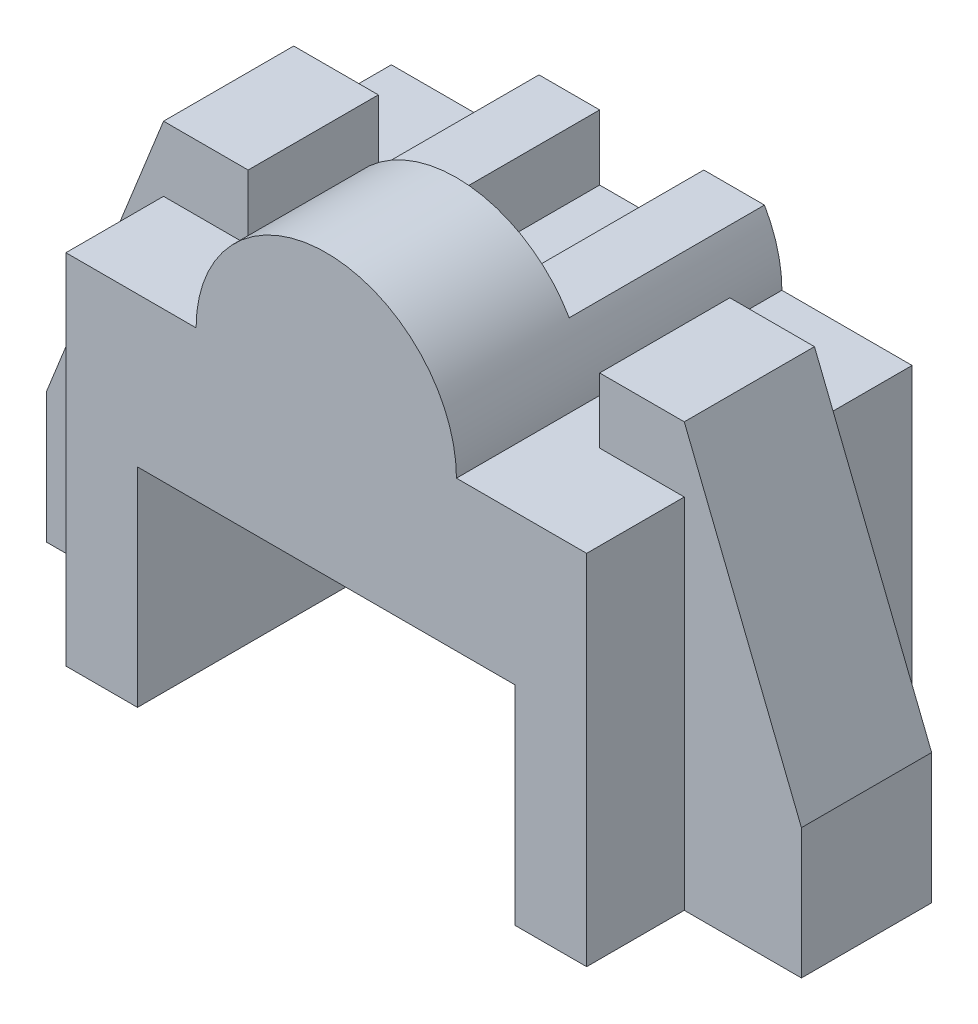
ISO-10303-21;
HEADER;
FILE_DESCRIPTION(('STEP AP214'),'2;1');
FILE_NAME('part.step','',(''),(''),'','','');
FILE_SCHEMA(('AUTOMOTIVE_DESIGN { 1 0 10303 214 1 1 1 1 }'));
ENDSEC;
DATA;
#1=APPLICATION_CONTEXT('core data for automotive mechanical design processes');
#2=APPLICATION_PROTOCOL_DEFINITION('international standard','automotive_design',2000,#1);
#3=PRODUCT_CONTEXT('',#1,'mechanical');
#4=PRODUCT('Part','Part','',(#3));
#5=PRODUCT_RELATED_PRODUCT_CATEGORY('part','',(#4));
#6=PRODUCT_DEFINITION_FORMATION('','',#4);
#7=PRODUCT_DEFINITION_CONTEXT('part definition',#1,'design');
#8=PRODUCT_DEFINITION('design','',#6,#7);
#9=PRODUCT_DEFINITION_SHAPE('','',#8);
#10=(LENGTH_UNIT() NAMED_UNIT(*) SI_UNIT(.MILLI.,.METRE.));
#11=(NAMED_UNIT(*) PLANE_ANGLE_UNIT() SI_UNIT($,.RADIAN.));
#12=(NAMED_UNIT(*) SI_UNIT($,.STERADIAN.) SOLID_ANGLE_UNIT());
#13=UNCERTAINTY_MEASURE_WITH_UNIT(LENGTH_MEASURE(1.E-05),#10,'distance_accuracy_value','');
#14=(GEOMETRIC_REPRESENTATION_CONTEXT(3) GLOBAL_UNCERTAINTY_ASSIGNED_CONTEXT((#13)) GLOBAL_UNIT_ASSIGNED_CONTEXT((#10,
#11,#12)) REPRESENTATION_CONTEXT('',''));
#15=CARTESIAN_POINT('',(0.,0.,0.));
#16=DIRECTION('',(0.,0.,1.));
#17=DIRECTION('',(1.,0.,0.));
#18=AXIS2_PLACEMENT_3D('',#15,#16,#17);
#19=CARTESIAN_POINT('',(40.,27.5,25.));
#20=DIRECTION('',(-1.,0.,0.));
#21=DIRECTION('',(0.,-1.,0.));
#22=AXIS2_PLACEMENT_3D('',#19,#20,#21);
#23=PLANE('',#22);
#24=DIRECTION('',(0.,-1.,0.));
#25=VECTOR('',#24,1.);
#26=CARTESIAN_POINT('',(40.,27.5,-10.));
#27=LINE('',#26,#25);
#28=CARTESIAN_POINT('',(40.,27.5,-10.));
#29=VERTEX_POINT('',#28);
#30=CARTESIAN_POINT('',(40.,-27.5,-10.));
#31=VERTEX_POINT('',#30);
#32=EDGE_CURVE('E48',#29,#31,#27,.T.);
#33=ORIENTED_EDGE('',*,*,#32,.T.);
#34=DIRECTION('',(0.,0.,-1.));
#35=VECTOR('',#34,1.);
#36=CARTESIAN_POINT('',(40.,-27.5,25.));
#37=LINE('',#36,#35);
#38=CARTESIAN_POINT('',(40.,-27.5,-25.));
#39=VERTEX_POINT('',#38);
#40=EDGE_CURVE('E442',#31,#39,#37,.T.);
#41=ORIENTED_EDGE('',*,*,#40,.T.);
#42=DIRECTION('',(0.,1.,0.));
#43=VECTOR('',#42,1.);
#44=CARTESIAN_POINT('',(40.,27.5,-25.));
#45=LINE('',#44,#43);
#46=CARTESIAN_POINT('',(40.,27.5,-25.));
#47=VERTEX_POINT('',#46);
#48=EDGE_CURVE('E383',#39,#47,#45,.T.);
#49=ORIENTED_EDGE('',*,*,#48,.T.);
#50=DIRECTION('',(0.,0.,-1.));
#51=VECTOR('',#50,1.);
#52=CARTESIAN_POINT('',(40.,27.5,25.));
#53=LINE('',#52,#51);
#54=EDGE_CURVE('E438',#29,#47,#53,.T.);
#55=ORIENTED_EDGE('',*,*,#54,.F.);
#56=EDGE_LOOP('',(#33,#41,#49,#55));
#57=FACE_BOUND('',#56,.T.);
#58=ADVANCED_FACE('F33',(#57),#23,.F.);
#59=CARTESIAN_POINT('',(-40.,-27.5,25.));
#60=DIRECTION('',(1.,0.,0.));
#61=DIRECTION('',(0.,0.,-1.));
#62=AXIS2_PLACEMENT_3D('',#59,#60,#61);
#63=PLANE('',#62);
#64=DIRECTION('',(0.,1.,0.));
#65=VECTOR('',#64,1.);
#66=CARTESIAN_POINT('',(-40.,27.5,-10.));
#67=LINE('',#66,#65);
#68=CARTESIAN_POINT('',(-40.,-27.5,-10.));
#69=VERTEX_POINT('',#68);
#70=CARTESIAN_POINT('',(-40.,27.5,-10.));
#71=VERTEX_POINT('',#70);
#72=EDGE_CURVE('E290',#69,#71,#67,.T.);
#73=ORIENTED_EDGE('',*,*,#72,.T.);
#74=DIRECTION('',(0.,0.,-1.));
#75=VECTOR('',#74,1.);
#76=CARTESIAN_POINT('',(-40.,27.5,25.));
#77=LINE('',#76,#75);
#78=CARTESIAN_POINT('',(-40.,27.5,-25.));
#79=VERTEX_POINT('',#78);
#80=EDGE_CURVE('E416',#71,#79,#77,.T.);
#81=ORIENTED_EDGE('',*,*,#80,.T.);
#82=DIRECTION('',(0.,-1.,0.));
#83=VECTOR('',#82,1.);
#84=CARTESIAN_POINT('',(-40.,-27.5,-25.));
#85=LINE('',#84,#83);
#86=CARTESIAN_POINT('',(-40.,-27.5,-25.));
#87=VERTEX_POINT('',#86);
#88=EDGE_CURVE('E354',#79,#87,#85,.T.);
#89=ORIENTED_EDGE('',*,*,#88,.T.);
#90=DIRECTION('',(0.,0.,-1.));
#91=VECTOR('',#90,1.);
#92=CARTESIAN_POINT('',(-40.,-27.5,25.));
#93=LINE('',#92,#91);
#94=EDGE_CURVE('E372',#69,#87,#93,.T.);
#95=ORIENTED_EDGE('',*,*,#94,.F.);
#96=EDGE_LOOP('',(#73,#81,#89,#95));
#97=FACE_BOUND('',#96,.T.);
#98=ADVANCED_FACE('F479',(#97),#63,.F.);
#99=CARTESIAN_POINT('',(8.,37.5,25.));
#100=DIRECTION('',(0.,-1.,0.));
#101=DIRECTION('',(0.,0.,-1.));
#102=AXIS2_PLACEMENT_3D('',#99,#100,#101);
#103=PLANE('',#102);
#104=DIRECTION('',(1.,0.,0.));
#105=VECTOR('',#104,1.);
#106=CARTESIAN_POINT('',(17.3205080756888,37.5,5.));
#107=LINE('',#106,#105);
#108=CARTESIAN_POINT('',(8.,37.5,5.));
#109=VERTEX_POINT('',#108);
#110=CARTESIAN_POINT('',(17.3205080756888,37.5,5.));
#111=VERTEX_POINT('',#110);
#112=EDGE_CURVE('E341',#109,#111,#107,.T.);
#113=ORIENTED_EDGE('',*,*,#112,.T.);
#114=DIRECTION('',(0.,0.,-1.));
#115=VECTOR('',#114,1.);
#116=CARTESIAN_POINT('',(17.3205080756888,37.5,25.));
#117=LINE('',#116,#115);
#118=CARTESIAN_POINT('',(17.3205080756888,37.5,-25.));
#119=VERTEX_POINT('',#118);
#120=EDGE_CURVE('E433',#111,#119,#117,.T.);
#121=ORIENTED_EDGE('',*,*,#120,.T.);
#122=DIRECTION('',(-1.,0.,0.));
#123=VECTOR('',#122,1.);
#124=CARTESIAN_POINT('',(8.,37.5,-25.));
#125=LINE('',#124,#123);
#126=CARTESIAN_POINT('',(8.,37.5,-25.));
#127=VERTEX_POINT('',#126);
#128=EDGE_CURVE('E391',#119,#127,#125,.T.);
#129=ORIENTED_EDGE('',*,*,#128,.T.);
#130=DIRECTION('',(0.,0.,-1.));
#131=VECTOR('',#130,1.);
#132=CARTESIAN_POINT('',(8.,37.5,25.));
#133=LINE('',#132,#131);
#134=EDGE_CURVE('E431',#109,#127,#133,.T.);
#135=ORIENTED_EDGE('',*,*,#134,.F.);
#136=EDGE_LOOP('',(#113,#121,#129,#135));
#137=FACE_BOUND('',#136,.T.);
#138=ADVANCED_FACE('F512',(#137),#103,.F.);
#139=CARTESIAN_POINT('',(8.,37.5,25.));
#140=DIRECTION('',(1.,0.,0.));
#141=DIRECTION('',(0.,0.,-1.));
#142=AXIS2_PLACEMENT_3D('',#139,#140,#141);
#143=PLANE('',#142);
#144=DIRECTION('',(0.,1.,0.));
#145=VECTOR('',#144,1.);
#146=CARTESIAN_POINT('',(8.,37.5,5.));
#147=LINE('',#146,#145);
#148=CARTESIAN_POINT('',(8.,27.5,5.));
#149=VERTEX_POINT('',#148);
#150=EDGE_CURVE('E338',#149,#109,#147,.T.);
#151=ORIENTED_EDGE('',*,*,#150,.T.);
#152=ORIENTED_EDGE('',*,*,#134,.T.);
#153=DIRECTION('',(0.,-1.,0.));
#154=VECTOR('',#153,1.);
#155=CARTESIAN_POINT('',(8.,37.5,-25.));
#156=LINE('',#155,#154);
#157=CARTESIAN_POINT('',(8.,27.5,-25.));
#158=VERTEX_POINT('',#157);
#159=EDGE_CURVE('E394',#127,#158,#156,.T.);
#160=ORIENTED_EDGE('',*,*,#159,.T.);
#161=DIRECTION('',(0.,0.,-1.));
#162=VECTOR('',#161,1.);
#163=CARTESIAN_POINT('',(8.,27.5,25.));
#164=LINE('',#163,#162);
#165=EDGE_CURVE('E429',#149,#158,#164,.T.);
#166=ORIENTED_EDGE('',*,*,#165,.F.);
#167=EDGE_LOOP('',(#151,#152,#160,#166));
#168=FACE_BOUND('',#167,.T.);
#169=ADVANCED_FACE('F509',(#168),#143,.F.);
#170=CARTESIAN_POINT('',(-8.,27.5,25.));
#171=DIRECTION('',(0.,-1.,0.));
#172=DIRECTION('',(0.,0.,-1.));
#173=AXIS2_PLACEMENT_3D('',#170,#171,#172);
#174=PLANE('',#173);
#175=DIRECTION('',(1.,0.,0.));
#176=VECTOR('',#175,1.);
#177=CARTESIAN_POINT('',(8.,27.5,5.));
#178=LINE('',#177,#176);
#179=CARTESIAN_POINT('',(-8.,27.5,5.));
#180=VERTEX_POINT('',#179);
#181=EDGE_CURVE('E335',#180,#149,#178,.T.);
#182=ORIENTED_EDGE('',*,*,#181,.T.);
#183=ORIENTED_EDGE('',*,*,#165,.T.);
#184=DIRECTION('',(-1.,0.,0.));
#185=VECTOR('',#184,1.);
#186=CARTESIAN_POINT('',(-8.,27.5,-25.));
#187=LINE('',#186,#185);
#188=CARTESIAN_POINT('',(-8.,27.5,-25.));
#189=VERTEX_POINT('',#188);
#190=EDGE_CURVE('E397',#158,#189,#187,.T.);
#191=ORIENTED_EDGE('',*,*,#190,.T.);
#192=DIRECTION('',(0.,0.,-1.));
#193=VECTOR('',#192,1.);
#194=CARTESIAN_POINT('',(-8.,27.5,25.));
#195=LINE('',#194,#193);
#196=EDGE_CURVE('E427',#180,#189,#195,.T.);
#197=ORIENTED_EDGE('',*,*,#196,.F.);
#198=EDGE_LOOP('',(#182,#183,#191,#197));
#199=FACE_BOUND('',#198,.T.);
#200=ADVANCED_FACE('F503',(#199),#174,.F.);
#201=CARTESIAN_POINT('',(-8.,27.5,25.));
#202=DIRECTION('',(-1.,0.,0.));
#203=DIRECTION('',(0.,0.,1.));
#204=AXIS2_PLACEMENT_3D('',#201,#202,#203);
#205=PLANE('',#204);
#206=DIRECTION('',(0.,-1.,0.));
#207=VECTOR('',#206,1.);
#208=CARTESIAN_POINT('',(-8.,27.5,5.));
#209=LINE('',#208,#207);
#210=CARTESIAN_POINT('',(-8.,37.5,5.));
#211=VERTEX_POINT('',#210);
#212=EDGE_CURVE('E332',#211,#180,#209,.T.);
#213=ORIENTED_EDGE('',*,*,#212,.T.);
#214=ORIENTED_EDGE('',*,*,#196,.T.);
#215=DIRECTION('',(0.,1.,0.));
#216=VECTOR('',#215,1.);
#217=CARTESIAN_POINT('',(-8.,27.5,-25.));
#218=LINE('',#217,#216);
#219=CARTESIAN_POINT('',(-8.,37.5,-25.));
#220=VERTEX_POINT('',#219);
#221=EDGE_CURVE('E400',#189,#220,#218,.T.);
#222=ORIENTED_EDGE('',*,*,#221,.T.);
#223=DIRECTION('',(0.,0.,-1.));
#224=VECTOR('',#223,1.);
#225=CARTESIAN_POINT('',(-8.,37.5,25.));
#226=LINE('',#225,#224);
#227=EDGE_CURVE('E425',#211,#220,#226,.T.);
#228=ORIENTED_EDGE('',*,*,#227,.F.);
#229=EDGE_LOOP('',(#213,#214,#222,#228));
#230=FACE_BOUND('',#229,.T.);
#231=ADVANCED_FACE('F500',(#230),#205,.F.);
#232=CARTESIAN_POINT('',(-8.,37.5,25.));
#233=DIRECTION('',(0.,-1.,0.));
#234=DIRECTION('',(0.,0.,-1.));
#235=AXIS2_PLACEMENT_3D('',#232,#233,#234);
#236=PLANE('',#235);
#237=DIRECTION('',(1.,0.,0.));
#238=VECTOR('',#237,1.);
#239=CARTESIAN_POINT('',(-8.,37.5,5.));
#240=LINE('',#239,#238);
#241=CARTESIAN_POINT('',(-17.3205080756888,37.5,5.));
#242=VERTEX_POINT('',#241);
#243=EDGE_CURVE('E346',#242,#211,#240,.T.);
#244=ORIENTED_EDGE('',*,*,#243,.T.);
#245=ORIENTED_EDGE('',*,*,#227,.T.);
#246=DIRECTION('',(-1.,0.,0.));
#247=VECTOR('',#246,1.);
#248=CARTESIAN_POINT('',(-8.,37.5,-25.));
#249=LINE('',#248,#247);
#250=CARTESIAN_POINT('',(-17.3205080756888,37.5,-25.));
#251=VERTEX_POINT('',#250);
#252=EDGE_CURVE('E403',#220,#251,#249,.T.);
#253=ORIENTED_EDGE('',*,*,#252,.T.);
#254=DIRECTION('',(0.,0.,-1.));
#255=VECTOR('',#254,1.);
#256=CARTESIAN_POINT('',(-17.3205080756888,37.5,25.));
#257=LINE('',#256,#255);
#258=EDGE_CURVE('E423',#242,#251,#257,.T.);
#259=ORIENTED_EDGE('',*,*,#258,.F.);
#260=EDGE_LOOP('',(#244,#245,#253,#259));
#261=FACE_BOUND('',#260,.T.);
#262=ADVANCED_FACE('F496',(#261),#236,.F.);
#263=CARTESIAN_POINT('',(-29.,-27.5,25.));
#264=DIRECTION('',(0.,1.,0.));
#265=DIRECTION('',(-1.,0.,0.));
#266=AXIS2_PLACEMENT_3D('',#263,#264,#265);
#267=PLANE('',#266);
#268=DIRECTION('',(1.,0.,0.));
#269=VECTOR('',#268,1.);
#270=CARTESIAN_POINT('',(-29.,-27.5,-25.));
#271=LINE('',#270,#269);
#272=CARTESIAN_POINT('',(-29.,-27.5,-25.));
#273=VERTEX_POINT('',#272);
#274=EDGE_CURVE('E349',#87,#273,#271,.T.);
#275=ORIENTED_EDGE('',*,*,#274,.T.);
#276=DIRECTION('',(0.,0.,-1.));
#277=VECTOR('',#276,1.);
#278=CARTESIAN_POINT('',(-29.,-27.5,25.));
#279=LINE('',#278,#277);
#280=CARTESIAN_POINT('',(-29.,-27.5,25.));
#281=VERTEX_POINT('',#280);
#282=EDGE_CURVE('E11',#281,#273,#279,.T.);
#283=ORIENTED_EDGE('',*,*,#282,.F.);
#284=DIRECTION('',(1.,0.,0.));
#285=VECTOR('',#284,1.);
#286=CARTESIAN_POINT('',(-29.,-27.5,25.));
#287=LINE('',#286,#285);
#288=CARTESIAN_POINT('',(-40.,-27.5,25.));
#289=VERTEX_POINT('',#288);
#290=EDGE_CURVE('E350',#289,#281,#287,.T.);
#291=ORIENTED_EDGE('',*,*,#290,.F.);
#292=CARTESIAN_POINT('',(-40.,-27.5,10.));
#293=VERTEX_POINT('',#292);
#294=EDGE_CURVE('E413',#289,#293,#93,.T.);
#295=ORIENTED_EDGE('',*,*,#294,.T.);
#296=DIRECTION('',(1.,0.,0.));
#297=VECTOR('',#296,1.);
#298=CARTESIAN_POINT('',(-40.,-27.5,10.));
#299=LINE('',#298,#297);
#300=CARTESIAN_POINT('',(-58.,-27.5,10.));
#301=VERTEX_POINT('',#300);
#302=EDGE_CURVE('E298',#301,#293,#299,.T.);
#303=ORIENTED_EDGE('',*,*,#302,.F.);
#304=DIRECTION('',(0.,0.,-1.));
#305=VECTOR('',#304,1.);
#306=CARTESIAN_POINT('',(-58.,-27.5,10.));
#307=LINE('',#306,#305);
#308=CARTESIAN_POINT('',(-58.,-27.5,-10.));
#309=VERTEX_POINT('',#308);
#310=EDGE_CURVE('E304',#301,#309,#307,.T.);
#311=ORIENTED_EDGE('',*,*,#310,.T.);
#312=DIRECTION('',(1.,0.,0.));
#313=VECTOR('',#312,1.);
#314=CARTESIAN_POINT('',(-40.,-27.5,-10.));
#315=LINE('',#314,#313);
#316=EDGE_CURVE('E314',#309,#69,#315,.T.);
#317=ORIENTED_EDGE('',*,*,#316,.T.);
#318=ORIENTED_EDGE('',*,*,#94,.T.);
#319=EDGE_LOOP('',(#275,#283,#291,#295,#303,#311,#317,#318));
#320=FACE_BOUND('',#319,.T.);
#321=ADVANCED_FACE('F35',(#320),#267,.F.);
#322=CARTESIAN_POINT('',(-29.,4.5,25.));
#323=DIRECTION('',(-1.,0.,0.));
#324=DIRECTION('',(0.,-1.,0.));
#325=AXIS2_PLACEMENT_3D('',#322,#323,#324);
#326=PLANE('',#325);
#327=DIRECTION('',(0.,1.,0.));
#328=VECTOR('',#327,1.);
#329=CARTESIAN_POINT('',(-29.,4.5,-25.));
#330=LINE('',#329,#328);
#331=CARTESIAN_POINT('',(-29.,4.5,-25.));
#332=VERTEX_POINT('',#331);
#333=EDGE_CURVE('E375',#273,#332,#330,.T.);
#334=ORIENTED_EDGE('',*,*,#333,.T.);
#335=DIRECTION('',(0.,0.,-1.));
#336=VECTOR('',#335,1.);
#337=CARTESIAN_POINT('',(-29.,4.5,25.));
#338=LINE('',#337,#336);
#339=CARTESIAN_POINT('',(-29.,4.5,25.));
#340=VERTEX_POINT('',#339);
#341=EDGE_CURVE('E41',#340,#332,#338,.T.);
#342=ORIENTED_EDGE('',*,*,#341,.F.);
#343=DIRECTION('',(0.,1.,0.));
#344=VECTOR('',#343,1.);
#345=CARTESIAN_POINT('',(-29.,4.5,25.));
#346=LINE('',#345,#344);
#347=EDGE_CURVE('E353',#281,#340,#346,.T.);
#348=ORIENTED_EDGE('',*,*,#347,.F.);
#349=ORIENTED_EDGE('',*,*,#282,.T.);
#350=EDGE_LOOP('',(#334,#342,#348,#349));
#351=FACE_BOUND('',#350,.T.);
#352=ADVANCED_FACE('F473',(#351),#326,.F.);
#353=CARTESIAN_POINT('',(29.,4.50000000000001,25.));
#354=DIRECTION('',(0.,1.,0.));
#355=DIRECTION('',(-1.,0.,0.));
#356=AXIS2_PLACEMENT_3D('',#353,#354,#355);
#357=PLANE('',#356);
#358=DIRECTION('',(1.,0.,0.));
#359=VECTOR('',#358,1.);
#360=CARTESIAN_POINT('',(29.,4.50000000000001,-25.));
#361=LINE('',#360,#359);
#362=CARTESIAN_POINT('',(29.,4.50000000000001,-25.));
#363=VERTEX_POINT('',#362);
#364=EDGE_CURVE('E377',#332,#363,#361,.T.);
#365=ORIENTED_EDGE('',*,*,#364,.T.);
#366=DIRECTION('',(0.,0.,-1.));
#367=VECTOR('',#366,1.);
#368=CARTESIAN_POINT('',(29.,4.50000000000001,25.));
#369=LINE('',#368,#367);
#370=CARTESIAN_POINT('',(29.,4.50000000000001,25.));
#371=VERTEX_POINT('',#370);
#372=EDGE_CURVE('E447',#371,#363,#369,.T.);
#373=ORIENTED_EDGE('',*,*,#372,.F.);
#374=DIRECTION('',(1.,0.,0.));
#375=VECTOR('',#374,1.);
#376=CARTESIAN_POINT('',(29.,4.50000000000001,25.));
#377=LINE('',#376,#375);
#378=EDGE_CURVE('E356',#340,#371,#377,.T.);
#379=ORIENTED_EDGE('',*,*,#378,.F.);
#380=ORIENTED_EDGE('',*,*,#341,.T.);
#381=EDGE_LOOP('',(#365,#373,#379,#380));
#382=FACE_BOUND('',#381,.T.);
#383=ADVANCED_FACE('F454',(#382),#357,.F.);
#384=CARTESIAN_POINT('',(29.,-27.5,25.));
#385=DIRECTION('',(1.,0.,0.));
#386=DIRECTION('',(0.,0.,-1.));
#387=AXIS2_PLACEMENT_3D('',#384,#385,#386);
#388=PLANE('',#387);
#389=DIRECTION('',(0.,-1.,0.));
#390=VECTOR('',#389,1.);
#391=CARTESIAN_POINT('',(29.,-27.5,-25.));
#392=LINE('',#391,#390);
#393=CARTESIAN_POINT('',(29.,-27.5,-25.));
#394=VERTEX_POINT('',#393);
#395=EDGE_CURVE('E379',#363,#394,#392,.T.);
#396=ORIENTED_EDGE('',*,*,#395,.T.);
#397=DIRECTION('',(0.,0.,-1.));
#398=VECTOR('',#397,1.);
#399=CARTESIAN_POINT('',(29.,-27.5,25.));
#400=LINE('',#399,#398);
#401=CARTESIAN_POINT('',(29.,-27.5,25.));
#402=VERTEX_POINT('',#401);
#403=EDGE_CURVE('E444',#402,#394,#400,.T.);
#404=ORIENTED_EDGE('',*,*,#403,.F.);
#405=DIRECTION('',(0.,-1.,0.));
#406=VECTOR('',#405,1.);
#407=CARTESIAN_POINT('',(29.,-27.5,25.));
#408=LINE('',#407,#406);
#409=EDGE_CURVE('E358',#371,#402,#408,.T.);
#410=ORIENTED_EDGE('',*,*,#409,.F.);
#411=ORIENTED_EDGE('',*,*,#372,.T.);
#412=EDGE_LOOP('',(#396,#404,#410,#411));
#413=FACE_BOUND('',#412,.T.);
#414=ADVANCED_FACE('F465',(#413),#388,.F.);
#415=CARTESIAN_POINT('',(40.,-27.5,25.));
#416=DIRECTION('',(0.,1.,0.));
#417=DIRECTION('',(0.,0.,1.));
#418=AXIS2_PLACEMENT_3D('',#415,#416,#417);
#419=PLANE('',#418);
#420=DIRECTION('',(1.,0.,0.));
#421=VECTOR('',#420,1.);
#422=CARTESIAN_POINT('',(40.,-27.5,-25.));
#423=LINE('',#422,#421);
#424=EDGE_CURVE('E381',#394,#39,#423,.T.);
#425=ORIENTED_EDGE('',*,*,#424,.T.);
#426=ORIENTED_EDGE('',*,*,#40,.F.);
#427=DIRECTION('',(1.,0.,0.));
#428=VECTOR('',#427,1.);
#429=CARTESIAN_POINT('',(40.,-27.5,-10.));
#430=LINE('',#429,#428);
#431=CARTESIAN_POINT('',(58.,-27.5,-10.));
#432=VERTEX_POINT('',#431);
#433=EDGE_CURVE('E247',#31,#432,#430,.T.);
#434=ORIENTED_EDGE('',*,*,#433,.T.);
#435=DIRECTION('',(0.,0.,-1.));
#436=VECTOR('',#435,1.);
#437=CARTESIAN_POINT('',(58.,-27.5,10.));
#438=LINE('',#437,#436);
#439=CARTESIAN_POINT('',(58.,-27.5,10.));
#440=VERTEX_POINT('',#439);
#441=EDGE_CURVE('E243',#440,#432,#438,.T.);
#442=ORIENTED_EDGE('',*,*,#441,.F.);
#443=DIRECTION('',(1.,0.,0.));
#444=VECTOR('',#443,1.);
#445=CARTESIAN_POINT('',(40.,-27.5,10.));
#446=LINE('',#445,#444);
#447=CARTESIAN_POINT('',(40.,-27.5,10.));
#448=VERTEX_POINT('',#447);
#449=EDGE_CURVE('E231',#448,#440,#446,.T.);
#450=ORIENTED_EDGE('',*,*,#449,.F.);
#451=CARTESIAN_POINT('',(40.,-27.5,25.));
#452=VERTEX_POINT('',#451);
#453=EDGE_CURVE('E56',#452,#448,#37,.T.);
#454=ORIENTED_EDGE('',*,*,#453,.F.);
#455=DIRECTION('',(1.,0.,0.));
#456=VECTOR('',#455,1.);
#457=CARTESIAN_POINT('',(40.,-27.5,25.));
#458=LINE('',#457,#456);
#459=EDGE_CURVE('E360',#402,#452,#458,.T.);
#460=ORIENTED_EDGE('',*,*,#459,.F.);
#461=ORIENTED_EDGE('',*,*,#403,.T.);
#462=EDGE_LOOP('',(#425,#426,#434,#442,#450,#454,#460,#461));
#463=FACE_BOUND('',#462,.T.);
#464=ADVANCED_FACE('F245',(#463),#419,.F.);
#465=ORIENTED_EDGE('',*,*,#453,.T.);
#466=DIRECTION('',(0.,-1.,0.));
#467=VECTOR('',#466,1.);
#468=CARTESIAN_POINT('',(40.,27.5,10.));
#469=LINE('',#468,#467);
#470=CARTESIAN_POINT('',(40.,27.5,10.));
#471=VERTEX_POINT('',#470);
#472=EDGE_CURVE('E239',#471,#448,#469,.T.);
#473=ORIENTED_EDGE('',*,*,#472,.F.);
#474=CARTESIAN_POINT('',(40.,27.5,25.));
#475=VERTEX_POINT('',#474);
#476=EDGE_CURVE('E439',#475,#471,#53,.T.);
#477=ORIENTED_EDGE('',*,*,#476,.F.);
#478=DIRECTION('',(0.,1.,0.));
#479=VECTOR('',#478,1.);
#480=CARTESIAN_POINT('',(40.,27.5,25.));
#481=LINE('',#480,#479);
#482=EDGE_CURVE('E362',#452,#475,#481,.T.);
#483=ORIENTED_EDGE('',*,*,#482,.F.);
#484=EDGE_LOOP('',(#465,#473,#477,#483));
#485=FACE_BOUND('',#484,.T.);
#486=ADVANCED_FACE('F539',(#485),#23,.F.);
#487=CARTESIAN_POINT('',(20.,27.5,25.));
#488=DIRECTION('',(0.,-1.,0.));
#489=DIRECTION('',(0.,0.,-1.));
#490=AXIS2_PLACEMENT_3D('',#487,#488,#489);
#491=PLANE('',#490);
#492=ORIENTED_EDGE('',*,*,#476,.T.);
#493=DIRECTION('',(1.,0.,0.));
#494=VECTOR('',#493,1.);
#495=CARTESIAN_POINT('',(27.,27.5,10.));
#496=LINE('',#495,#494);
#497=CARTESIAN_POINT('',(27.,27.5,10.));
#498=VERTEX_POINT('',#497);
#499=EDGE_CURVE('E536',#498,#471,#496,.T.);
#500=ORIENTED_EDGE('',*,*,#499,.F.);
#501=DIRECTION('',(0.,0.,-1.));
#502=VECTOR('',#501,1.);
#503=CARTESIAN_POINT('',(27.,27.5,10.));
#504=LINE('',#503,#502);
#505=CARTESIAN_POINT('',(27.,27.5,-10.));
#506=VERTEX_POINT('',#505);
#507=EDGE_CURVE('E250',#498,#506,#504,.T.);
#508=ORIENTED_EDGE('',*,*,#507,.T.);
#509=DIRECTION('',(1.,0.,0.));
#510=VECTOR('',#509,1.);
#511=CARTESIAN_POINT('',(27.,27.5,-10.));
#512=LINE('',#511,#510);
#513=EDGE_CURVE('E267',#506,#29,#512,.T.);
#514=ORIENTED_EDGE('',*,*,#513,.T.);
#515=ORIENTED_EDGE('',*,*,#54,.T.);
#516=DIRECTION('',(-1.,0.,0.));
#517=VECTOR('',#516,1.);
#518=CARTESIAN_POINT('',(20.,27.5,-25.));
#519=LINE('',#518,#517);
#520=CARTESIAN_POINT('',(20.,27.5,-25.));
#521=VERTEX_POINT('',#520);
#522=EDGE_CURVE('E386',#47,#521,#519,.T.);
#523=ORIENTED_EDGE('',*,*,#522,.T.);
#524=DIRECTION('',(0.,0.,-1.));
#525=VECTOR('',#524,1.);
#526=CARTESIAN_POINT('',(20.,27.5,25.));
#527=LINE('',#526,#525);
#528=CARTESIAN_POINT('',(20.,27.5,25.));
#529=VERTEX_POINT('',#528);
#530=EDGE_CURVE('E435',#529,#521,#527,.T.);
#531=ORIENTED_EDGE('',*,*,#530,.F.);
#532=DIRECTION('',(-1.,0.,0.));
#533=VECTOR('',#532,1.);
#534=CARTESIAN_POINT('',(20.,27.5,25.));
#535=LINE('',#534,#533);
#536=EDGE_CURVE('E364',#475,#529,#535,.T.);
#537=ORIENTED_EDGE('',*,*,#536,.F.);
#538=EDGE_LOOP('',(#492,#500,#508,#514,#515,#523,#531,#537));
#539=FACE_BOUND('',#538,.T.);
#540=ADVANCED_FACE('F517',(#539),#491,.F.);
#541=CARTESIAN_POINT('',(0.,27.5,25.));
#542=DIRECTION('',(0.,0.,-1.));
#543=DIRECTION('',(-1.,0.,0.));
#544=AXIS2_PLACEMENT_3D('',#541,#542,#543);
#545=CYLINDRICAL_SURFACE('',#544,20.);
#546=CARTESIAN_POINT('',(0.,27.5,-25.));
#547=DIRECTION('',(0.,0.,1.));
#548=DIRECTION('',(1.,0.,0.));
#549=AXIS2_PLACEMENT_3D('',#546,#547,#548);
#550=CIRCLE('',#549,20.);
#551=CARTESIAN_POINT('',(-20.,27.5,-25.));
#552=VERTEX_POINT('',#551);
#553=EDGE_CURVE('E406',#251,#552,#550,.T.);
#554=ORIENTED_EDGE('',*,*,#553,.T.);
#555=DIRECTION('',(0.,0.,-1.));
#556=VECTOR('',#555,1.);
#557=CARTESIAN_POINT('',(-20.,27.5,25.));
#558=LINE('',#557,#556);
#559=CARTESIAN_POINT('',(-20.,27.5,25.));
#560=VERTEX_POINT('',#559);
#561=EDGE_CURVE('E420',#560,#552,#558,.T.);
#562=ORIENTED_EDGE('',*,*,#561,.F.);
#563=CARTESIAN_POINT('',(0.,27.5,25.));
#564=DIRECTION('',(0.,0.,1.));
#565=DIRECTION('',(1.,0.,0.));
#566=AXIS2_PLACEMENT_3D('',#563,#564,#565);
#567=CIRCLE('',#566,20.);
#568=EDGE_CURVE('E366',#529,#560,#567,.T.);
#569=ORIENTED_EDGE('',*,*,#568,.F.);
#570=ORIENTED_EDGE('',*,*,#530,.T.);
#571=CARTESIAN_POINT('',(0.,27.5,-25.));
#572=DIRECTION('',(0.,0.,1.));
#573=DIRECTION('',(1.,0.,0.));
#574=AXIS2_PLACEMENT_3D('',#571,#572,#573);
#575=CIRCLE('',#574,20.);
#576=EDGE_CURVE('E388',#521,#119,#575,.T.);
#577=ORIENTED_EDGE('',*,*,#576,.T.);
#578=ORIENTED_EDGE('',*,*,#120,.F.);
#579=CARTESIAN_POINT('',(0.,27.5,5.));
#580=DIRECTION('',(0.,0.,1.));
#581=DIRECTION('',(1.,0.,0.));
#582=AXIS2_PLACEMENT_3D('',#579,#580,#581);
#583=CIRCLE('',#582,20.);
#584=EDGE_CURVE('E344',#111,#242,#583,.T.);
#585=ORIENTED_EDGE('',*,*,#584,.T.);
#586=ORIENTED_EDGE('',*,*,#258,.T.);
#587=EDGE_LOOP('',(#554,#562,#569,#570,#577,#578,#585,#586));
#588=FACE_BOUND('',#587,.T.);
#589=ADVANCED_FACE('F490',(#588),#545,.T.);
#590=CARTESIAN_POINT('',(-40.,27.5,25.));
#591=DIRECTION('',(0.,-1.,0.));
#592=DIRECTION('',(0.,0.,-1.));
#593=AXIS2_PLACEMENT_3D('',#590,#591,#592);
#594=PLANE('',#593);
#595=DIRECTION('',(0.,0.,-1.));
#596=VECTOR('',#595,1.);
#597=CARTESIAN_POINT('',(-27.,27.5,10.));
#598=LINE('',#597,#596);
#599=CARTESIAN_POINT('',(-27.,27.5,10.));
#600=VERTEX_POINT('',#599);
#601=CARTESIAN_POINT('',(-27.,27.5,-10.));
#602=VERTEX_POINT('',#601);
#603=EDGE_CURVE('E329',#600,#602,#598,.T.);
#604=ORIENTED_EDGE('',*,*,#603,.F.);
#605=DIRECTION('',(1.,0.,0.));
#606=VECTOR('',#605,1.);
#607=CARTESIAN_POINT('',(-27.,27.5,10.));
#608=LINE('',#607,#606);
#609=CARTESIAN_POINT('',(-40.,27.5,10.));
#610=VERTEX_POINT('',#609);
#611=EDGE_CURVE('E286',#610,#600,#608,.T.);
#612=ORIENTED_EDGE('',*,*,#611,.F.);
#613=CARTESIAN_POINT('',(-40.,27.5,25.));
#614=VERTEX_POINT('',#613);
#615=EDGE_CURVE('E417',#614,#610,#77,.T.);
#616=ORIENTED_EDGE('',*,*,#615,.F.);
#617=DIRECTION('',(-1.,0.,0.));
#618=VECTOR('',#617,1.);
#619=CARTESIAN_POINT('',(-40.,27.5,25.));
#620=LINE('',#619,#618);
#621=EDGE_CURVE('E368',#560,#614,#620,.T.);
#622=ORIENTED_EDGE('',*,*,#621,.F.);
#623=ORIENTED_EDGE('',*,*,#561,.T.);
#624=DIRECTION('',(-1.,0.,0.));
#625=VECTOR('',#624,1.);
#626=CARTESIAN_POINT('',(-40.,27.5,-25.));
#627=LINE('',#626,#625);
#628=EDGE_CURVE('E408',#552,#79,#627,.T.);
#629=ORIENTED_EDGE('',*,*,#628,.T.);
#630=ORIENTED_EDGE('',*,*,#80,.F.);
#631=DIRECTION('',(1.,0.,0.));
#632=VECTOR('',#631,1.);
#633=CARTESIAN_POINT('',(-27.,27.5,-10.));
#634=LINE('',#633,#632);
#635=EDGE_CURVE('E285',#71,#602,#634,.T.);
#636=ORIENTED_EDGE('',*,*,#635,.T.);
#637=EDGE_LOOP('',(#604,#612,#616,#622,#623,#629,#630,#636));
#638=FACE_BOUND('',#637,.T.);
#639=ADVANCED_FACE('F484',(#638),#594,.F.);
#640=ORIENTED_EDGE('',*,*,#615,.T.);
#641=DIRECTION('',(0.,1.,0.));
#642=VECTOR('',#641,1.);
#643=CARTESIAN_POINT('',(-40.,27.5,10.));
#644=LINE('',#643,#642);
#645=EDGE_CURVE('E301',#293,#610,#644,.T.);
#646=ORIENTED_EDGE('',*,*,#645,.F.);
#647=ORIENTED_EDGE('',*,*,#294,.F.);
#648=DIRECTION('',(0.,-1.,0.));
#649=VECTOR('',#648,1.);
#650=CARTESIAN_POINT('',(-40.,-27.5,25.));
#651=LINE('',#650,#649);
#652=EDGE_CURVE('E370',#614,#289,#651,.T.);
#653=ORIENTED_EDGE('',*,*,#652,.F.);
#654=EDGE_LOOP('',(#640,#646,#647,#653));
#655=FACE_BOUND('',#654,.T.);
#656=ADVANCED_FACE('F553',(#655),#63,.F.);
#657=CARTESIAN_POINT('',(0.,27.5,25.));
#658=DIRECTION('',(0.,0.,1.));
#659=DIRECTION('',(1.,0.,0.));
#660=AXIS2_PLACEMENT_3D('',#657,#658,#659);
#661=PLANE('',#660);
#662=ORIENTED_EDGE('',*,*,#568,.T.);
#663=ORIENTED_EDGE('',*,*,#621,.T.);
#664=ORIENTED_EDGE('',*,*,#652,.T.);
#665=ORIENTED_EDGE('',*,*,#290,.T.);
#666=ORIENTED_EDGE('',*,*,#347,.T.);
#667=ORIENTED_EDGE('',*,*,#378,.T.);
#668=ORIENTED_EDGE('',*,*,#409,.T.);
#669=ORIENTED_EDGE('',*,*,#459,.T.);
#670=ORIENTED_EDGE('',*,*,#482,.T.);
#671=ORIENTED_EDGE('',*,*,#536,.T.);
#672=EDGE_LOOP('',(#662,#663,#664,#665,#666,#667,#668,#669,#670,#671));
#673=FACE_BOUND('',#672,.T.);
#674=ADVANCED_FACE('F469',(#673),#661,.T.);
#675=CARTESIAN_POINT('',(0.,27.5,-25.));
#676=DIRECTION('',(0.,0.,1.));
#677=DIRECTION('',(1.,0.,0.));
#678=AXIS2_PLACEMENT_3D('',#675,#676,#677);
#679=PLANE('',#678);
#680=ORIENTED_EDGE('',*,*,#274,.F.);
#681=ORIENTED_EDGE('',*,*,#88,.F.);
#682=ORIENTED_EDGE('',*,*,#628,.F.);
#683=ORIENTED_EDGE('',*,*,#553,.F.);
#684=ORIENTED_EDGE('',*,*,#252,.F.);
#685=ORIENTED_EDGE('',*,*,#221,.F.);
#686=ORIENTED_EDGE('',*,*,#190,.F.);
#687=ORIENTED_EDGE('',*,*,#159,.F.);
#688=ORIENTED_EDGE('',*,*,#128,.F.);
#689=ORIENTED_EDGE('',*,*,#576,.F.);
#690=ORIENTED_EDGE('',*,*,#522,.F.);
#691=ORIENTED_EDGE('',*,*,#48,.F.);
#692=ORIENTED_EDGE('',*,*,#424,.F.);
#693=ORIENTED_EDGE('',*,*,#395,.F.);
#694=ORIENTED_EDGE('',*,*,#364,.F.);
#695=ORIENTED_EDGE('',*,*,#333,.F.);
#696=EDGE_LOOP('',(#680,#681,#682,#683,#684,#685,#686,#687,#688,#689,#690,#691,#692,#693,#694,#695));
#697=FACE_BOUND('',#696,.T.);
#698=ADVANCED_FACE('F460',(#697),#679,.F.);
#699=CARTESIAN_POINT('',(0.,27.5,5.));
#700=DIRECTION('',(0.,0.,1.));
#701=DIRECTION('',(1.,0.,0.));
#702=AXIS2_PLACEMENT_3D('',#699,#700,#701);
#703=PLANE('',#702);
#704=ORIENTED_EDGE('',*,*,#212,.F.);
#705=ORIENTED_EDGE('',*,*,#243,.F.);
#706=ORIENTED_EDGE('',*,*,#584,.F.);
#707=ORIENTED_EDGE('',*,*,#112,.F.);
#708=ORIENTED_EDGE('',*,*,#150,.F.);
#709=ORIENTED_EDGE('',*,*,#181,.F.);
#710=EDGE_LOOP('',(#704,#705,#706,#707,#708,#709));
#711=FACE_BOUND('',#710,.T.);
#712=ADVANCED_FACE('F609',(#711),#703,.F.);
#713=CARTESIAN_POINT('',(-27.,37.5,10.));
#714=DIRECTION('',(-1.,0.,0.));
#715=DIRECTION('',(0.,-1.,0.));
#716=AXIS2_PLACEMENT_3D('',#713,#714,#715);
#717=PLANE('',#716);
#718=DIRECTION('',(0.,1.,0.));
#719=VECTOR('',#718,1.);
#720=CARTESIAN_POINT('',(-27.,37.5,-10.));
#721=LINE('',#720,#719);
#722=CARTESIAN_POINT('',(-27.,37.5,-10.));
#723=VERTEX_POINT('',#722);
#724=EDGE_CURVE('E306',#602,#723,#721,.T.);
#725=ORIENTED_EDGE('',*,*,#724,.T.);
#726=DIRECTION('',(0.,0.,-1.));
#727=VECTOR('',#726,1.);
#728=CARTESIAN_POINT('',(-27.,37.5,10.));
#729=LINE('',#728,#727);
#730=CARTESIAN_POINT('',(-27.,37.5,10.));
#731=VERTEX_POINT('',#730);
#732=EDGE_CURVE('E326',#731,#723,#729,.T.);
#733=ORIENTED_EDGE('',*,*,#732,.F.);
#734=DIRECTION('',(0.,1.,0.));
#735=VECTOR('',#734,1.);
#736=CARTESIAN_POINT('',(-27.,37.5,10.));
#737=LINE('',#736,#735);
#738=EDGE_CURVE('E289',#600,#731,#737,.T.);
#739=ORIENTED_EDGE('',*,*,#738,.F.);
#740=ORIENTED_EDGE('',*,*,#603,.T.);
#741=EDGE_LOOP('',(#725,#733,#739,#740));
#742=FACE_BOUND('',#741,.T.);
#743=ADVANCED_FACE('F585',(#742),#717,.F.);
#744=CARTESIAN_POINT('',(-40.,37.5,10.));
#745=DIRECTION('',(0.,-1.,0.));
#746=DIRECTION('',(1.,0.,0.));
#747=AXIS2_PLACEMENT_3D('',#744,#745,#746);
#748=PLANE('',#747);
#749=DIRECTION('',(-1.,0.,0.));
#750=VECTOR('',#749,1.);
#751=CARTESIAN_POINT('',(-40.,37.5,-10.));
#752=LINE('',#751,#750);
#753=CARTESIAN_POINT('',(-40.,37.5,-10.));
#754=VERTEX_POINT('',#753);
#755=EDGE_CURVE('E308',#723,#754,#752,.T.);
#756=ORIENTED_EDGE('',*,*,#755,.T.);
#757=DIRECTION('',(0.,0.,-1.));
#758=VECTOR('',#757,1.);
#759=CARTESIAN_POINT('',(-40.,37.5,10.));
#760=LINE('',#759,#758);
#761=CARTESIAN_POINT('',(-40.,37.5,10.));
#762=VERTEX_POINT('',#761);
#763=EDGE_CURVE('E323',#762,#754,#760,.T.);
#764=ORIENTED_EDGE('',*,*,#763,.F.);
#765=DIRECTION('',(-1.,0.,0.));
#766=VECTOR('',#765,1.);
#767=CARTESIAN_POINT('',(-40.,37.5,10.));
#768=LINE('',#767,#766);
#769=EDGE_CURVE('E292',#731,#762,#768,.T.);
#770=ORIENTED_EDGE('',*,*,#769,.F.);
#771=ORIENTED_EDGE('',*,*,#732,.T.);
#772=EDGE_LOOP('',(#756,#764,#770,#771));
#773=FACE_BOUND('',#772,.T.);
#774=ADVANCED_FACE('F591',(#773),#748,.F.);
#775=CARTESIAN_POINT('',(-58.,-7.50000000000001,10.));
#776=DIRECTION('',(0.928476690885259,-0.371390676354104,0.));
#777=DIRECTION('',(0.371390676354104,0.928476690885259,0.));
#778=AXIS2_PLACEMENT_3D('',#775,#776,#777);
#779=PLANE('',#778);
#780=DIRECTION('',(-0.371390676354104,-0.928476690885259,0.));
#781=VECTOR('',#780,1.);
#782=CARTESIAN_POINT('',(-58.,-7.50000000000001,-10.));
#783=LINE('',#782,#781);
#784=CARTESIAN_POINT('',(-58.,-7.50000000000001,-10.));
#785=VERTEX_POINT('',#784);
#786=EDGE_CURVE('E310',#754,#785,#783,.T.);
#787=ORIENTED_EDGE('',*,*,#786,.T.);
#788=DIRECTION('',(0.,0.,-1.));
#789=VECTOR('',#788,1.);
#790=CARTESIAN_POINT('',(-58.,-7.50000000000001,10.));
#791=LINE('',#790,#789);
#792=CARTESIAN_POINT('',(-58.,-7.50000000000001,10.));
#793=VERTEX_POINT('',#792);
#794=EDGE_CURVE('E320',#793,#785,#791,.T.);
#795=ORIENTED_EDGE('',*,*,#794,.F.);
#796=DIRECTION('',(-0.371390676354104,-0.928476690885259,0.));
#797=VECTOR('',#796,1.);
#798=CARTESIAN_POINT('',(-58.,-7.50000000000001,10.));
#799=LINE('',#798,#797);
#800=EDGE_CURVE('E294',#762,#793,#799,.T.);
#801=ORIENTED_EDGE('',*,*,#800,.F.);
#802=ORIENTED_EDGE('',*,*,#763,.T.);
#803=EDGE_LOOP('',(#787,#795,#801,#802));
#804=FACE_BOUND('',#803,.T.);
#805=ADVANCED_FACE('F593',(#804),#779,.F.);
#806=CARTESIAN_POINT('',(-58.,-27.5,10.));
#807=DIRECTION('',(1.,0.,0.));
#808=DIRECTION('',(0.,1.,0.));
#809=AXIS2_PLACEMENT_3D('',#806,#807,#808);
#810=PLANE('',#809);
#811=DIRECTION('',(0.,-1.,0.));
#812=VECTOR('',#811,1.);
#813=CARTESIAN_POINT('',(-58.,-27.5,-10.));
#814=LINE('',#813,#812);
#815=EDGE_CURVE('E312',#785,#309,#814,.T.);
#816=ORIENTED_EDGE('',*,*,#815,.T.);
#817=ORIENTED_EDGE('',*,*,#310,.F.);
#818=DIRECTION('',(0.,-1.,0.));
#819=VECTOR('',#818,1.);
#820=CARTESIAN_POINT('',(-58.,-27.5,10.));
#821=LINE('',#820,#819);
#822=EDGE_CURVE('E296',#793,#301,#821,.T.);
#823=ORIENTED_EDGE('',*,*,#822,.F.);
#824=ORIENTED_EDGE('',*,*,#794,.T.);
#825=EDGE_LOOP('',(#816,#817,#823,#824));
#826=FACE_BOUND('',#825,.T.);
#827=ADVANCED_FACE('F594',(#826),#810,.F.);
#828=CARTESIAN_POINT('',(0.,0.,10.));
#829=DIRECTION('',(0.,0.,1.));
#830=DIRECTION('',(1.,0.,0.));
#831=AXIS2_PLACEMENT_3D('',#828,#829,#830);
#832=PLANE('',#831);
#833=ORIENTED_EDGE('',*,*,#611,.T.);
#834=ORIENTED_EDGE('',*,*,#738,.T.);
#835=ORIENTED_EDGE('',*,*,#769,.T.);
#836=ORIENTED_EDGE('',*,*,#800,.T.);
#837=ORIENTED_EDGE('',*,*,#822,.T.);
#838=ORIENTED_EDGE('',*,*,#302,.T.);
#839=ORIENTED_EDGE('',*,*,#645,.T.);
#840=EDGE_LOOP('',(#833,#834,#835,#836,#837,#838,#839));
#841=FACE_BOUND('',#840,.T.);
#842=ADVANCED_FACE('F570',(#841),#832,.T.);
#843=CARTESIAN_POINT('',(0.,0.,-10.));
#844=DIRECTION('',(0.,0.,1.));
#845=DIRECTION('',(1.,0.,0.));
#846=AXIS2_PLACEMENT_3D('',#843,#844,#845);
#847=PLANE('',#846);
#848=ORIENTED_EDGE('',*,*,#635,.F.);
#849=ORIENTED_EDGE('',*,*,#72,.F.);
#850=ORIENTED_EDGE('',*,*,#316,.F.);
#851=ORIENTED_EDGE('',*,*,#815,.F.);
#852=ORIENTED_EDGE('',*,*,#786,.F.);
#853=ORIENTED_EDGE('',*,*,#755,.F.);
#854=ORIENTED_EDGE('',*,*,#724,.F.);
#855=EDGE_LOOP('',(#848,#849,#850,#851,#852,#853,#854));
#856=FACE_BOUND('',#855,.T.);
#857=ADVANCED_FACE('F578',(#856),#847,.F.);
#858=CARTESIAN_POINT('',(27.,37.5,10.));
#859=DIRECTION('',(1.,0.,0.));
#860=DIRECTION('',(0.,1.,0.));
#861=AXIS2_PLACEMENT_3D('',#858,#859,#860);
#862=PLANE('',#861);
#863=DIRECTION('',(0.,-1.,0.));
#864=VECTOR('',#863,1.);
#865=CARTESIAN_POINT('',(27.,37.5,-10.));
#866=LINE('',#865,#864);
#867=CARTESIAN_POINT('',(27.,37.5,-10.));
#868=VERTEX_POINT('',#867);
#869=EDGE_CURVE('E264',#868,#506,#866,.T.);
#870=ORIENTED_EDGE('',*,*,#869,.T.);
#871=ORIENTED_EDGE('',*,*,#507,.F.);
#872=DIRECTION('',(0.,-1.,0.));
#873=VECTOR('',#872,1.);
#874=CARTESIAN_POINT('',(27.,37.5,10.));
#875=LINE('',#874,#873);
#876=CARTESIAN_POINT('',(27.,37.5,10.));
#877=VERTEX_POINT('',#876);
#878=EDGE_CURVE('E277',#877,#498,#875,.T.);
#879=ORIENTED_EDGE('',*,*,#878,.F.);
#880=DIRECTION('',(0.,0.,-1.));
#881=VECTOR('',#880,1.);
#882=CARTESIAN_POINT('',(27.,37.5,10.));
#883=LINE('',#882,#881);
#884=EDGE_CURVE('E263',#877,#868,#883,.T.);
#885=ORIENTED_EDGE('',*,*,#884,.T.);
#886=EDGE_LOOP('',(#870,#871,#879,#885));
#887=FACE_BOUND('',#886,.T.);
#888=ADVANCED_FACE('F535',(#887),#862,.F.);
#889=CARTESIAN_POINT('',(58.,-27.5,10.));
#890=DIRECTION('',(-1.,0.,0.));
#891=DIRECTION('',(0.,-1.,0.));
#892=AXIS2_PLACEMENT_3D('',#889,#890,#891);
#893=PLANE('',#892);
#894=DIRECTION('',(0.,1.,0.));
#895=VECTOR('',#894,1.);
#896=CARTESIAN_POINT('',(58.,-27.5,-10.));
#897=LINE('',#896,#895);
#898=CARTESIAN_POINT('',(58.,-7.49999999999999,-10.));
#899=VERTEX_POINT('',#898);
#900=EDGE_CURVE('E271',#432,#899,#897,.T.);
#901=ORIENTED_EDGE('',*,*,#900,.T.);
#902=DIRECTION('',(0.,0.,-1.));
#903=VECTOR('',#902,1.);
#904=CARTESIAN_POINT('',(58.,-7.49999999999999,10.));
#905=LINE('',#904,#903);
#906=CARTESIAN_POINT('',(58.,-7.49999999999999,10.));
#907=VERTEX_POINT('',#906);
#908=EDGE_CURVE('E251',#907,#899,#905,.T.);
#909=ORIENTED_EDGE('',*,*,#908,.F.);
#910=DIRECTION('',(0.,1.,0.));
#911=VECTOR('',#910,1.);
#912=CARTESIAN_POINT('',(58.,-27.5,10.));
#913=LINE('',#912,#911);
#914=EDGE_CURVE('E236',#440,#907,#913,.T.);
#915=ORIENTED_EDGE('',*,*,#914,.F.);
#916=ORIENTED_EDGE('',*,*,#441,.T.);
#917=EDGE_LOOP('',(#901,#909,#915,#916));
#918=FACE_BOUND('',#917,.T.);
#919=ADVANCED_FACE('F253',(#918),#893,.F.);
#920=CARTESIAN_POINT('',(58.,-7.49999999999999,10.));
#921=DIRECTION('',(-0.928476690885259,-0.371390676354104,0.));
#922=DIRECTION('',(0.371390676354104,-0.928476690885259,0.));
#923=AXIS2_PLACEMENT_3D('',#920,#921,#922);
#924=PLANE('',#923);
#925=DIRECTION('',(-0.371390676354104,0.928476690885259,0.));
#926=VECTOR('',#925,1.);
#927=CARTESIAN_POINT('',(58.,-7.49999999999999,-10.));
#928=LINE('',#927,#926);
#929=CARTESIAN_POINT('',(40.,37.5,-10.));
#930=VERTEX_POINT('',#929);
#931=EDGE_CURVE('E273',#899,#930,#928,.T.);
#932=ORIENTED_EDGE('',*,*,#931,.T.);
#933=DIRECTION('',(0.,0.,-1.));
#934=VECTOR('',#933,1.);
#935=CARTESIAN_POINT('',(40.,37.5,10.));
#936=LINE('',#935,#934);
#937=CARTESIAN_POINT('',(40.,37.5,10.));
#938=VERTEX_POINT('',#937);
#939=EDGE_CURVE('E280',#938,#930,#936,.T.);
#940=ORIENTED_EDGE('',*,*,#939,.F.);
#941=DIRECTION('',(-0.371390676354104,0.928476690885259,0.));
#942=VECTOR('',#941,1.);
#943=CARTESIAN_POINT('',(58.,-7.49999999999999,10.));
#944=LINE('',#943,#942);
#945=EDGE_CURVE('E256',#907,#938,#944,.T.);
#946=ORIENTED_EDGE('',*,*,#945,.F.);
#947=ORIENTED_EDGE('',*,*,#908,.T.);
#948=EDGE_LOOP('',(#932,#940,#946,#947));
#949=FACE_BOUND('',#948,.T.);
#950=ADVANCED_FACE('F526',(#949),#924,.F.);
#951=CARTESIAN_POINT('',(40.,37.5,10.));
#952=DIRECTION('',(0.,-1.,0.));
#953=DIRECTION('',(1.,0.,0.));
#954=AXIS2_PLACEMENT_3D('',#951,#952,#953);
#955=PLANE('',#954);
#956=DIRECTION('',(-1.,0.,0.));
#957=VECTOR('',#956,1.);
#958=CARTESIAN_POINT('',(40.,37.5,-10.));
#959=LINE('',#958,#957);
#960=EDGE_CURVE('E275',#930,#868,#959,.T.);
#961=ORIENTED_EDGE('',*,*,#960,.T.);
#962=ORIENTED_EDGE('',*,*,#884,.F.);
#963=DIRECTION('',(-1.,0.,0.));
#964=VECTOR('',#963,1.);
#965=CARTESIAN_POINT('',(40.,37.5,10.));
#966=LINE('',#965,#964);
#967=EDGE_CURVE('E258',#938,#877,#966,.T.);
#968=ORIENTED_EDGE('',*,*,#967,.F.);
#969=ORIENTED_EDGE('',*,*,#939,.T.);
#970=EDGE_LOOP('',(#961,#962,#968,#969));
#971=FACE_BOUND('',#970,.T.);
#972=ADVANCED_FACE('F533',(#971),#955,.F.);
#973=CARTESIAN_POINT('',(0.,0.,10.));
#974=DIRECTION('',(0.,0.,1.));
#975=DIRECTION('',(1.,0.,0.));
#976=AXIS2_PLACEMENT_3D('',#973,#974,#975);
#977=PLANE('',#976);
#978=ORIENTED_EDGE('',*,*,#878,.T.);
#979=ORIENTED_EDGE('',*,*,#499,.T.);
#980=ORIENTED_EDGE('',*,*,#472,.T.);
#981=ORIENTED_EDGE('',*,*,#449,.T.);
#982=ORIENTED_EDGE('',*,*,#914,.T.);
#983=ORIENTED_EDGE('',*,*,#945,.T.);
#984=ORIENTED_EDGE('',*,*,#967,.T.);
#985=EDGE_LOOP('',(#978,#979,#980,#981,#982,#983,#984));
#986=FACE_BOUND('',#985,.T.);
#987=ADVANCED_FACE('F234',(#986),#977,.T.);
#988=CARTESIAN_POINT('',(0.,0.,-10.));
#989=DIRECTION('',(0.,0.,1.));
#990=DIRECTION('',(1.,0.,0.));
#991=AXIS2_PLACEMENT_3D('',#988,#989,#990);
#992=PLANE('',#991);
#993=ORIENTED_EDGE('',*,*,#869,.F.);
#994=ORIENTED_EDGE('',*,*,#960,.F.);
#995=ORIENTED_EDGE('',*,*,#931,.F.);
#996=ORIENTED_EDGE('',*,*,#900,.F.);
#997=ORIENTED_EDGE('',*,*,#433,.F.);
#998=ORIENTED_EDGE('',*,*,#32,.F.);
#999=ORIENTED_EDGE('',*,*,#513,.F.);
#1000=EDGE_LOOP('',(#993,#994,#995,#996,#997,#998,#999));
#1001=FACE_BOUND('',#1000,.T.);
#1002=ADVANCED_FACE('F522',(#1001),#992,.F.);
#1003=CLOSED_SHELL('',(#58,#98,#138,#169,#200,#231,#262,#321,#352,#383,#414,#464,#486,#540,#589,
#639,#656,#674,#698,#712,#743,#774,#805,#827,#842,#857,#888,#919,#950,#972,#987,#1002));
#1004=MANIFOLD_SOLID_BREP('B2',#1003);
#1005=ADVANCED_BREP_SHAPE_REPRESENTATION('',(#18,#1004),#14);
#1006=SHAPE_DEFINITION_REPRESENTATION(#9,#1005);
ENDSEC;
END-ISO-10303-21;
